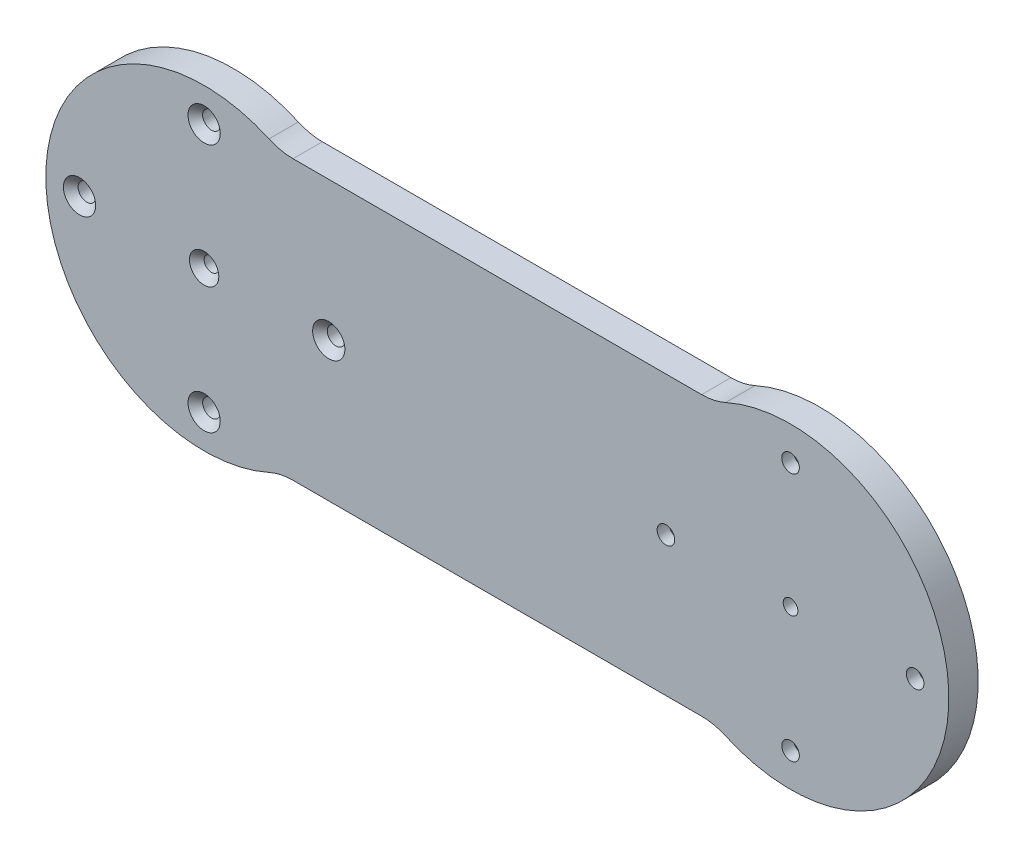
ISO-10303-21;
HEADER;
FILE_DESCRIPTION(('STEP AP214'),'2;1');
FILE_NAME('part.step','',(''),(''),'','','');
FILE_SCHEMA(('AUTOMOTIVE_DESIGN { 1 0 10303 214 1 1 1 1 }'));
ENDSEC;
DATA;
#1=APPLICATION_CONTEXT('core data for automotive mechanical design processes');
#2=APPLICATION_PROTOCOL_DEFINITION('international standard','automotive_design',2000,#1);
#3=PRODUCT_CONTEXT('',#1,'mechanical');
#4=PRODUCT('Part','Part','',(#3));
#5=PRODUCT_RELATED_PRODUCT_CATEGORY('part','',(#4));
#6=PRODUCT_DEFINITION_FORMATION('','',#4);
#7=PRODUCT_DEFINITION_CONTEXT('part definition',#1,'design');
#8=PRODUCT_DEFINITION('design','',#6,#7);
#9=PRODUCT_DEFINITION_SHAPE('','',#8);
#10=(LENGTH_UNIT() NAMED_UNIT(*) SI_UNIT(.MILLI.,.METRE.));
#11=(NAMED_UNIT(*) PLANE_ANGLE_UNIT() SI_UNIT($,.RADIAN.));
#12=(NAMED_UNIT(*) SI_UNIT($,.STERADIAN.) SOLID_ANGLE_UNIT());
#13=UNCERTAINTY_MEASURE_WITH_UNIT(LENGTH_MEASURE(1.E-05),#10,'distance_accuracy_value','');
#14=(GEOMETRIC_REPRESENTATION_CONTEXT(3) GLOBAL_UNCERTAINTY_ASSIGNED_CONTEXT((#13)) GLOBAL_UNIT_ASSIGNED_CONTEXT((#10,
#11,#12)) REPRESENTATION_CONTEXT('',''));
#15=CARTESIAN_POINT('',(0.,0.,0.));
#16=DIRECTION('',(0.,0.,1.));
#17=DIRECTION('',(1.,0.,0.));
#18=AXIS2_PLACEMENT_3D('',#15,#16,#17);
#19=CARTESIAN_POINT('',(124.619535604546,0.,10.));
#20=DIRECTION('',(0.,0.,-1.));
#21=DIRECTION('',(-1.,0.,0.));
#22=AXIS2_PLACEMENT_3D('',#19,#20,#21);
#23=CYLINDRICAL_SURFACE('',#22,2.50000000000001);
#24=CARTESIAN_POINT('',(124.619535604546,0.,10.));
#25=DIRECTION('',(0.,0.,-1.));
#26=DIRECTION('',(-1.,0.,0.));
#27=AXIS2_PLACEMENT_3D('',#24,#25,#26);
#28=CIRCLE('',#27,2.50000000000001);
#29=CARTESIAN_POINT('',(122.119535604546,0.,10.));
#30=VERTEX_POINT('',#29);
#31=EDGE_CURVE('E167',#30,#30,#28,.T.);
#32=ORIENTED_EDGE('',*,*,#31,.F.);
#33=EDGE_LOOP('',(#32));
#34=FACE_BOUND('',#33,.T.);
#35=CARTESIAN_POINT('',(124.619535604546,0.,6.));
#36=DIRECTION('',(0.,0.,-1.));
#37=DIRECTION('',(-1.,0.,0.));
#38=AXIS2_PLACEMENT_3D('',#35,#36,#37);
#39=CIRCLE('',#38,2.50000000000001);
#40=CARTESIAN_POINT('',(122.119535604546,0.,6.));
#41=VERTEX_POINT('',#40);
#42=EDGE_CURVE('E184',#41,#41,#39,.F.);
#43=ORIENTED_EDGE('',*,*,#42,.F.);
#44=EDGE_LOOP('',(#43));
#45=FACE_BOUND('',#44,.T.);
#46=ADVANCED_FACE('F36',(#34,#45),#23,.F.);
#47=CARTESIAN_POINT('',(82.1195356045464,0.,10.));
#48=DIRECTION('',(0.,0.,-1.));
#49=DIRECTION('',(-1.,0.,0.));
#50=AXIS2_PLACEMENT_3D('',#47,#48,#49);
#51=CYLINDRICAL_SURFACE('',#50,3.00000000000001);
#52=CARTESIAN_POINT('',(82.1195356045464,0.,10.));
#53=DIRECTION('',(0.,0.,-1.));
#54=DIRECTION('',(-1.,0.,0.));
#55=AXIS2_PLACEMENT_3D('',#52,#53,#54);
#56=CIRCLE('',#55,3.00000000000001);
#57=CARTESIAN_POINT('',(79.1195356045464,0.,10.));
#58=VERTEX_POINT('',#57);
#59=EDGE_CURVE('E241',#58,#58,#56,.T.);
#60=ORIENTED_EDGE('',*,*,#59,.F.);
#61=EDGE_LOOP('',(#60));
#62=FACE_BOUND('',#61,.T.);
#63=CARTESIAN_POINT('',(82.1195356045464,0.,6.));
#64=DIRECTION('',(0.,0.,-1.));
#65=DIRECTION('',(-1.,0.,0.));
#66=AXIS2_PLACEMENT_3D('',#63,#64,#65);
#67=CIRCLE('',#66,3.00000000000001);
#68=CARTESIAN_POINT('',(79.1195356045464,0.,6.));
#69=VERTEX_POINT('',#68);
#70=EDGE_CURVE('E179',#69,#69,#67,.F.);
#71=ORIENTED_EDGE('',*,*,#70,.F.);
#72=EDGE_LOOP('',(#71));
#73=FACE_BOUND('',#72,.T.);
#74=ADVANCED_FACE('F348',(#62,#73),#51,.F.);
#75=CARTESIAN_POINT('',(124.619535604546,-42.5,10.));
#76=DIRECTION('',(0.,0.,-1.));
#77=DIRECTION('',(-1.,0.,0.));
#78=AXIS2_PLACEMENT_3D('',#75,#76,#77);
#79=CYLINDRICAL_SURFACE('',#78,3.00000000000001);
#80=CARTESIAN_POINT('',(124.619535604546,-42.5,10.));
#81=DIRECTION('',(0.,0.,-1.));
#82=DIRECTION('',(-1.,0.,0.));
#83=AXIS2_PLACEMENT_3D('',#80,#81,#82);
#84=CIRCLE('',#83,3.00000000000001);
#85=CARTESIAN_POINT('',(121.619535604546,-42.5,10.));
#86=VERTEX_POINT('',#85);
#87=EDGE_CURVE('E245',#86,#86,#84,.T.);
#88=ORIENTED_EDGE('',*,*,#87,.F.);
#89=EDGE_LOOP('',(#88));
#90=FACE_BOUND('',#89,.T.);
#91=CARTESIAN_POINT('',(124.619535604546,-42.5,6.));
#92=DIRECTION('',(0.,0.,-1.));
#93=DIRECTION('',(-1.,0.,0.));
#94=AXIS2_PLACEMENT_3D('',#91,#92,#93);
#95=CIRCLE('',#94,3.00000000000001);
#96=CARTESIAN_POINT('',(121.619535604546,-42.5,6.));
#97=VERTEX_POINT('',#96);
#98=EDGE_CURVE('E174',#97,#97,#95,.F.);
#99=ORIENTED_EDGE('',*,*,#98,.F.);
#100=EDGE_LOOP('',(#99));
#101=FACE_BOUND('',#100,.T.);
#102=ADVANCED_FACE('F353',(#90,#101),#79,.F.);
#103=CARTESIAN_POINT('',(167.119535604546,0.,10.));
#104=DIRECTION('',(0.,0.,-1.));
#105=DIRECTION('',(-1.,0.,0.));
#106=AXIS2_PLACEMENT_3D('',#103,#104,#105);
#107=CYLINDRICAL_SURFACE('',#106,2.99999999999999);
#108=CARTESIAN_POINT('',(167.119535604546,0.,10.));
#109=DIRECTION('',(0.,0.,-1.));
#110=DIRECTION('',(-1.,0.,0.));
#111=AXIS2_PLACEMENT_3D('',#108,#109,#110);
#112=CIRCLE('',#111,2.99999999999999);
#113=CARTESIAN_POINT('',(164.119535604546,0.,10.));
#114=VERTEX_POINT('',#113);
#115=EDGE_CURVE('E237',#114,#114,#112,.T.);
#116=ORIENTED_EDGE('',*,*,#115,.F.);
#117=EDGE_LOOP('',(#116));
#118=FACE_BOUND('',#117,.T.);
#119=CARTESIAN_POINT('',(167.119535604546,0.,6.));
#120=DIRECTION('',(0.,0.,-1.));
#121=DIRECTION('',(-1.,0.,0.));
#122=AXIS2_PLACEMENT_3D('',#119,#120,#121);
#123=CIRCLE('',#122,2.99999999999999);
#124=CARTESIAN_POINT('',(164.119535604546,0.,6.));
#125=VERTEX_POINT('',#124);
#126=EDGE_CURVE('E169',#125,#125,#123,.F.);
#127=ORIENTED_EDGE('',*,*,#126,.F.);
#128=EDGE_LOOP('',(#127));
#129=FACE_BOUND('',#128,.T.);
#130=ADVANCED_FACE('F358',(#118,#129),#107,.F.);
#131=CARTESIAN_POINT('',(124.619535604546,42.5,10.));
#132=DIRECTION('',(0.,0.,-1.));
#133=DIRECTION('',(-1.,0.,0.));
#134=AXIS2_PLACEMENT_3D('',#131,#132,#133);
#135=CYLINDRICAL_SURFACE('',#134,3.00000000000001);
#136=CARTESIAN_POINT('',(124.619535604546,42.5,10.));
#137=DIRECTION('',(0.,0.,-1.));
#138=DIRECTION('',(-1.,0.,0.));
#139=AXIS2_PLACEMENT_3D('',#136,#137,#138);
#140=CIRCLE('',#139,3.00000000000001);
#141=CARTESIAN_POINT('',(121.619535604546,42.5,10.));
#142=VERTEX_POINT('',#141);
#143=EDGE_CURVE('E248',#142,#142,#140,.T.);
#144=ORIENTED_EDGE('',*,*,#143,.F.);
#145=EDGE_LOOP('',(#144));
#146=FACE_BOUND('',#145,.T.);
#147=CARTESIAN_POINT('',(124.619535604546,42.5,6.));
#148=DIRECTION('',(0.,0.,-1.));
#149=DIRECTION('',(-1.,0.,0.));
#150=AXIS2_PLACEMENT_3D('',#147,#148,#149);
#151=CIRCLE('',#150,3.00000000000001);
#152=CARTESIAN_POINT('',(121.619535604546,42.5,6.));
#153=VERTEX_POINT('',#152);
#154=EDGE_CURVE('E164',#153,#153,#151,.F.);
#155=ORIENTED_EDGE('',*,*,#154,.F.);
#156=EDGE_LOOP('',(#155));
#157=FACE_BOUND('',#156,.T.);
#158=ADVANCED_FACE('F360',(#146,#157),#135,.F.);
#159=CARTESIAN_POINT('',(-75.3804643954536,0.,10.));
#160=DIRECTION('',(0.,0.,-1.));
#161=DIRECTION('',(-1.,0.,0.));
#162=AXIS2_PLACEMENT_3D('',#159,#160,#161);
#163=CYLINDRICAL_SURFACE('',#162,54.);
#164=CARTESIAN_POINT('',(-75.3804643954536,0.,0.));
#165=DIRECTION('',(0.,0.,1.));
#166=DIRECTION('',(1.,0.,0.));
#167=AXIS2_PLACEMENT_3D('',#164,#165,#166);
#168=CIRCLE('',#167,54.);
#169=CARTESIAN_POINT('',(-53.2496733159261,49.2567567567568,0.));
#170=VERTEX_POINT('',#169);
#171=CARTESIAN_POINT('',(-53.2496733159261,-49.2567567567568,0.));
#172=VERTEX_POINT('',#171);
#173=EDGE_CURVE('E135',#170,#172,#168,.T.);
#174=ORIENTED_EDGE('',*,*,#173,.T.);
#175=DIRECTION('',(0.,0.,-1.));
#176=VECTOR('',#175,1.);
#177=CARTESIAN_POINT('',(-53.2496733159261,-49.2567567567568,10.));
#178=LINE('',#177,#176);
#179=CARTESIAN_POINT('',(-53.2496733159261,-49.2567567567568,10.));
#180=VERTEX_POINT('',#179);
#181=EDGE_CURVE('E147',#172,#180,#178,.F.);
#182=ORIENTED_EDGE('',*,*,#181,.T.);
#183=CARTESIAN_POINT('',(-75.3804643954536,0.,10.));
#184=DIRECTION('',(0.,0.,1.));
#185=DIRECTION('',(1.,0.,0.));
#186=AXIS2_PLACEMENT_3D('',#183,#184,#185);
#187=CIRCLE('',#186,54.);
#188=CARTESIAN_POINT('',(-53.2496733159261,49.2567567567568,10.));
#189=VERTEX_POINT('',#188);
#190=EDGE_CURVE('E133',#189,#180,#187,.T.);
#191=ORIENTED_EDGE('',*,*,#190,.F.);
#192=DIRECTION('',(0.,0.,-1.));
#193=VECTOR('',#192,1.);
#194=CARTESIAN_POINT('',(-53.2496733159261,49.2567567567568,10.));
#195=LINE('',#194,#193);
#196=EDGE_CURVE('E144',#189,#170,#195,.T.);
#197=ORIENTED_EDGE('',*,*,#196,.T.);
#198=EDGE_LOOP('',(#174,#182,#191,#197));
#199=FACE_BOUND('',#198,.T.);
#200=ADVANCED_FACE('F259',(#199),#163,.T.);
#201=CARTESIAN_POINT('',(-49.694865317371,-47.5,10.));
#202=DIRECTION('',(0.,1.,0.));
#203=DIRECTION('',(0.,0.,1.));
#204=AXIS2_PLACEMENT_3D('',#201,#202,#203);
#205=PLANE('',#204);
#206=DIRECTION('',(1.,0.,0.));
#207=VECTOR('',#206,1.);
#208=CARTESIAN_POINT('',(-49.694865317371,-47.5,0.));
#209=LINE('',#208,#207);
#210=CARTESIAN_POINT('',(-45.0530840272122,-47.5,0.));
#211=VERTEX_POINT('',#210);
#212=CARTESIAN_POINT('',(94.2921552363049,-47.5,0.));
#213=VERTEX_POINT('',#212);
#214=EDGE_CURVE('E131',#211,#213,#209,.T.);
#215=ORIENTED_EDGE('',*,*,#214,.T.);
#216=DIRECTION('',(0.,0.,1.));
#217=VECTOR('',#216,1.);
#218=CARTESIAN_POINT('',(94.2921552363049,-47.5,10.));
#219=LINE('',#218,#217);
#220=CARTESIAN_POINT('',(94.2921552363049,-47.5,10.));
#221=VERTEX_POINT('',#220);
#222=EDGE_CURVE('E108',#213,#221,#219,.T.);
#223=ORIENTED_EDGE('',*,*,#222,.T.);
#224=DIRECTION('',(1.,0.,0.));
#225=VECTOR('',#224,1.);
#226=CARTESIAN_POINT('',(-49.694865317371,-47.5,10.));
#227=LINE('',#226,#225);
#228=CARTESIAN_POINT('',(-45.0530840272122,-47.5,10.));
#229=VERTEX_POINT('',#228);
#230=EDGE_CURVE('E264',#229,#221,#227,.T.);
#231=ORIENTED_EDGE('',*,*,#230,.F.);
#232=DIRECTION('',(0.,0.,1.));
#233=VECTOR('',#232,1.);
#234=CARTESIAN_POINT('',(-45.0530840272122,-47.5,0.));
#235=LINE('',#234,#233);
#236=EDGE_CURVE('E123',#229,#211,#235,.F.);
#237=ORIENTED_EDGE('',*,*,#236,.T.);
#238=EDGE_LOOP('',(#215,#223,#231,#237));
#239=FACE_BOUND('',#238,.T.);
#240=ADVANCED_FACE('F373',(#239),#205,.F.);
#241=CARTESIAN_POINT('',(124.619535604546,0.,10.));
#242=DIRECTION('',(0.,0.,-1.));
#243=DIRECTION('',(-1.,0.,0.));
#244=AXIS2_PLACEMENT_3D('',#241,#242,#243);
#245=CYLINDRICAL_SURFACE('',#244,54.);
#246=CARTESIAN_POINT('',(124.619535604546,0.,10.));
#247=DIRECTION('',(0.,0.,1.));
#248=DIRECTION('',(1.,0.,0.));
#249=AXIS2_PLACEMENT_3D('',#246,#247,#248);
#250=CIRCLE('',#249,54.);
#251=CARTESIAN_POINT('',(102.488744525019,-49.2567567567568,10.));
#252=VERTEX_POINT('',#251);
#253=CARTESIAN_POINT('',(102.488744525019,49.2567567567568,10.));
#254=VERTEX_POINT('',#253);
#255=EDGE_CURVE('E122',#252,#254,#250,.T.);
#256=ORIENTED_EDGE('',*,*,#255,.F.);
#257=DIRECTION('',(0.,0.,-1.));
#258=VECTOR('',#257,1.);
#259=CARTESIAN_POINT('',(102.488744525019,-49.2567567567568,10.));
#260=LINE('',#259,#258);
#261=CARTESIAN_POINT('',(102.488744525019,-49.2567567567568,0.));
#262=VERTEX_POINT('',#261);
#263=EDGE_CURVE('E107',#252,#262,#260,.T.);
#264=ORIENTED_EDGE('',*,*,#263,.T.);
#265=CARTESIAN_POINT('',(124.619535604546,0.,0.));
#266=DIRECTION('',(0.,0.,1.));
#267=DIRECTION('',(1.,0.,0.));
#268=AXIS2_PLACEMENT_3D('',#265,#266,#267);
#269=CIRCLE('',#268,54.);
#270=CARTESIAN_POINT('',(102.488744525019,49.2567567567568,0.));
#271=VERTEX_POINT('',#270);
#272=EDGE_CURVE('E120',#262,#271,#269,.T.);
#273=ORIENTED_EDGE('',*,*,#272,.T.);
#274=DIRECTION('',(0.,0.,-1.));
#275=VECTOR('',#274,1.);
#276=CARTESIAN_POINT('',(102.488744525019,49.2567567567568,10.));
#277=LINE('',#276,#275);
#278=EDGE_CURVE('E124',#271,#254,#277,.F.);
#279=ORIENTED_EDGE('',*,*,#278,.T.);
#280=EDGE_LOOP('',(#256,#264,#273,#279));
#281=FACE_BOUND('',#280,.T.);
#282=ADVANCED_FACE('F119',(#281),#245,.T.);
#283=CARTESIAN_POINT('',(-49.694865317371,47.5,10.));
#284=DIRECTION('',(0.,-1.,0.));
#285=DIRECTION('',(0.,0.,-1.));
#286=AXIS2_PLACEMENT_3D('',#283,#284,#285);
#287=PLANE('',#286);
#288=DIRECTION('',(-1.,0.,0.));
#289=VECTOR('',#288,1.);
#290=CARTESIAN_POINT('',(-49.694865317371,47.5,10.));
#291=LINE('',#290,#289);
#292=CARTESIAN_POINT('',(94.2921552363049,47.5,10.));
#293=VERTEX_POINT('',#292);
#294=CARTESIAN_POINT('',(-45.0530840272122,47.5,10.));
#295=VERTEX_POINT('',#294);
#296=EDGE_CURVE('E139',#293,#295,#291,.T.);
#297=ORIENTED_EDGE('',*,*,#296,.F.);
#298=DIRECTION('',(0.,0.,1.));
#299=VECTOR('',#298,1.);
#300=CARTESIAN_POINT('',(94.2921552363049,47.5,0.));
#301=LINE('',#300,#299);
#302=CARTESIAN_POINT('',(94.2921552363049,47.5,0.));
#303=VERTEX_POINT('',#302);
#304=EDGE_CURVE('E114',#293,#303,#301,.F.);
#305=ORIENTED_EDGE('',*,*,#304,.T.);
#306=DIRECTION('',(-1.,0.,0.));
#307=VECTOR('',#306,1.);
#308=CARTESIAN_POINT('',(-49.694865317371,47.5,0.));
#309=LINE('',#308,#307);
#310=CARTESIAN_POINT('',(-45.0530840272122,47.5,0.));
#311=VERTEX_POINT('',#310);
#312=EDGE_CURVE('E130',#303,#311,#309,.T.);
#313=ORIENTED_EDGE('',*,*,#312,.T.);
#314=DIRECTION('',(0.,0.,1.));
#315=VECTOR('',#314,1.);
#316=CARTESIAN_POINT('',(-45.0530840272122,47.5,10.));
#317=LINE('',#316,#315);
#318=EDGE_CURVE('E51',#311,#295,#317,.T.);
#319=ORIENTED_EDGE('',*,*,#318,.T.);
#320=EDGE_LOOP('',(#297,#305,#313,#319));
#321=FACE_BOUND('',#320,.T.);
#322=ADVANCED_FACE('F226',(#321),#287,.F.);
#323=CARTESIAN_POINT('',(-75.3804643954536,0.,10.));
#324=DIRECTION('',(0.,0.,1.));
#325=DIRECTION('',(1.,0.,0.));
#326=AXIS2_PLACEMENT_3D('',#323,#324,#325);
#327=PLANE('',#326);
#328=CARTESIAN_POINT('',(-32.8804643954536,0.,10.));
#329=DIRECTION('',(0.,0.,1.));
#330=DIRECTION('',(1.,0.,0.));
#331=AXIS2_PLACEMENT_3D('',#328,#329,#330);
#332=CIRCLE('',#331,5.49999999999998);
#333=CARTESIAN_POINT('',(-27.3804643954537,0.,10.));
#334=VERTEX_POINT('',#333);
#335=EDGE_CURVE('E200',#334,#334,#332,.F.);
#336=ORIENTED_EDGE('',*,*,#335,.T.);
#337=EDGE_LOOP('',(#336));
#338=FACE_BOUND('',#337,.T.);
#339=CARTESIAN_POINT('',(-75.3804643954536,0.,10.));
#340=DIRECTION('',(0.,0.,1.));
#341=DIRECTION('',(1.,0.,0.));
#342=AXIS2_PLACEMENT_3D('',#339,#340,#341);
#343=CIRCLE('',#342,5.00000000000002);
#344=CARTESIAN_POINT('',(-70.3804643954536,0.,10.));
#345=VERTEX_POINT('',#344);
#346=EDGE_CURVE('E197',#345,#345,#343,.F.);
#347=ORIENTED_EDGE('',*,*,#346,.T.);
#348=EDGE_LOOP('',(#347));
#349=FACE_BOUND('',#348,.T.);
#350=CARTESIAN_POINT('',(-75.3804643954536,42.5,10.));
#351=DIRECTION('',(0.,0.,1.));
#352=DIRECTION('',(1.,0.,0.));
#353=AXIS2_PLACEMENT_3D('',#350,#351,#352);
#354=CIRCLE('',#353,5.50000000000006);
#355=CARTESIAN_POINT('',(-69.8804643954536,42.5,10.));
#356=VERTEX_POINT('',#355);
#357=EDGE_CURVE('E194',#356,#356,#354,.F.);
#358=ORIENTED_EDGE('',*,*,#357,.T.);
#359=EDGE_LOOP('',(#358));
#360=FACE_BOUND('',#359,.T.);
#361=CARTESIAN_POINT('',(-117.880464395454,0.,10.));
#362=DIRECTION('',(0.,0.,1.));
#363=DIRECTION('',(1.,0.,0.));
#364=AXIS2_PLACEMENT_3D('',#361,#362,#363);
#365=CIRCLE('',#364,5.50000000000006);
#366=CARTESIAN_POINT('',(-112.380464395454,0.,10.));
#367=VERTEX_POINT('',#366);
#368=EDGE_CURVE('E191',#367,#367,#365,.F.);
#369=ORIENTED_EDGE('',*,*,#368,.T.);
#370=EDGE_LOOP('',(#369));
#371=FACE_BOUND('',#370,.T.);
#372=CARTESIAN_POINT('',(-75.3804643954536,-42.5,10.));
#373=DIRECTION('',(0.,0.,1.));
#374=DIRECTION('',(1.,0.,0.));
#375=AXIS2_PLACEMENT_3D('',#372,#373,#374);
#376=CIRCLE('',#375,5.50000000000006);
#377=CARTESIAN_POINT('',(-69.8804643954536,-42.5,10.));
#378=VERTEX_POINT('',#377);
#379=EDGE_CURVE('E163',#378,#378,#376,.F.);
#380=ORIENTED_EDGE('',*,*,#379,.T.);
#381=EDGE_LOOP('',(#380));
#382=FACE_BOUND('',#381,.T.);
#383=ORIENTED_EDGE('',*,*,#31,.T.);
#384=EDGE_LOOP('',(#383));
#385=FACE_BOUND('',#384,.T.);
#386=ORIENTED_EDGE('',*,*,#115,.T.);
#387=EDGE_LOOP('',(#386));
#388=FACE_BOUND('',#387,.T.);
#389=ORIENTED_EDGE('',*,*,#59,.T.);
#390=EDGE_LOOP('',(#389));
#391=FACE_BOUND('',#390,.T.);
#392=ORIENTED_EDGE('',*,*,#87,.T.);
#393=EDGE_LOOP('',(#392));
#394=FACE_BOUND('',#393,.T.);
#395=ORIENTED_EDGE('',*,*,#143,.T.);
#396=EDGE_LOOP('',(#395));
#397=FACE_BOUND('',#396,.T.);
#398=ORIENTED_EDGE('',*,*,#296,.T.);
#399=CARTESIAN_POINT('',(-45.0530840272122,67.5,10.));
#400=DIRECTION('',(0.,0.,1.));
#401=DIRECTION('',(1.,0.,0.));
#402=AXIS2_PLACEMENT_3D('',#399,#400,#401);
#403=CIRCLE('',#402,20.);
#404=EDGE_CURVE('E161',#295,#189,#403,.F.);
#405=ORIENTED_EDGE('',*,*,#404,.T.);
#406=ORIENTED_EDGE('',*,*,#190,.T.);
#407=CARTESIAN_POINT('',(-45.0530840272122,-67.5,10.));
#408=DIRECTION('',(0.,0.,1.));
#409=DIRECTION('',(1.,0.,0.));
#410=AXIS2_PLACEMENT_3D('',#407,#408,#409);
#411=CIRCLE('',#410,20.);
#412=EDGE_CURVE('E155',#180,#229,#411,.F.);
#413=ORIENTED_EDGE('',*,*,#412,.T.);
#414=ORIENTED_EDGE('',*,*,#230,.T.);
#415=CARTESIAN_POINT('',(94.2921552363049,-67.5,10.));
#416=DIRECTION('',(0.,0.,1.));
#417=DIRECTION('',(1.,0.,0.));
#418=AXIS2_PLACEMENT_3D('',#415,#416,#417);
#419=CIRCLE('',#418,20.);
#420=EDGE_CURVE('E113',#221,#252,#419,.F.);
#421=ORIENTED_EDGE('',*,*,#420,.T.);
#422=ORIENTED_EDGE('',*,*,#255,.T.);
#423=CARTESIAN_POINT('',(94.2921552363049,67.5,10.));
#424=DIRECTION('',(0.,0.,1.));
#425=DIRECTION('',(1.,0.,0.));
#426=AXIS2_PLACEMENT_3D('',#423,#424,#425);
#427=CIRCLE('',#426,20.);
#428=EDGE_CURVE('E58',#254,#293,#427,.F.);
#429=ORIENTED_EDGE('',*,*,#428,.T.);
#430=EDGE_LOOP('',(#398,#405,#406,#413,#414,#421,#422,#429));
#431=FACE_BOUND('',#430,.T.);
#432=ADVANCED_FACE('F223',(#338,#349,#360,#371,#382,#385,#388,#391,#394,#397,#431),#327,.T.);
#433=CARTESIAN_POINT('',(-75.3804643954536,0.,0.));
#434=DIRECTION('',(0.,0.,1.));
#435=DIRECTION('',(1.,0.,0.));
#436=AXIS2_PLACEMENT_3D('',#433,#434,#435);
#437=PLANE('',#436);
#438=CARTESIAN_POINT('',(-117.880464395454,0.,0.));
#439=DIRECTION('',(0.,0.,-1.));
#440=DIRECTION('',(-1.,0.,0.));
#441=AXIS2_PLACEMENT_3D('',#438,#439,#440);
#442=CIRCLE('',#441,3.00000000000001);
#443=CARTESIAN_POINT('',(-120.880464395454,0.,0.));
#444=VERTEX_POINT('',#443);
#445=EDGE_CURVE('E305',#444,#444,#442,.T.);
#446=ORIENTED_EDGE('',*,*,#445,.F.);
#447=EDGE_LOOP('',(#446));
#448=FACE_BOUND('',#447,.T.);
#449=CARTESIAN_POINT('',(-32.8804643954536,0.,0.));
#450=DIRECTION('',(0.,0.,-1.));
#451=DIRECTION('',(-1.,0.,0.));
#452=AXIS2_PLACEMENT_3D('',#449,#450,#451);
#453=CIRCLE('',#452,3.);
#454=CARTESIAN_POINT('',(-35.8804643954536,0.,0.));
#455=VERTEX_POINT('',#454);
#456=EDGE_CURVE('E302',#455,#455,#453,.T.);
#457=ORIENTED_EDGE('',*,*,#456,.F.);
#458=EDGE_LOOP('',(#457));
#459=FACE_BOUND('',#458,.T.);
#460=CARTESIAN_POINT('',(-75.3804643954536,-42.5,0.));
#461=DIRECTION('',(0.,0.,-1.));
#462=DIRECTION('',(-1.,0.,0.));
#463=AXIS2_PLACEMENT_3D('',#460,#461,#462);
#464=CIRCLE('',#463,3.00000000000001);
#465=CARTESIAN_POINT('',(-78.3804643954536,-42.5,0.));
#466=VERTEX_POINT('',#465);
#467=EDGE_CURVE('E299',#466,#466,#464,.T.);
#468=ORIENTED_EDGE('',*,*,#467,.F.);
#469=EDGE_LOOP('',(#468));
#470=FACE_BOUND('',#469,.T.);
#471=CARTESIAN_POINT('',(-75.3804643954536,42.5,0.));
#472=DIRECTION('',(0.,0.,-1.));
#473=DIRECTION('',(-1.,0.,0.));
#474=AXIS2_PLACEMENT_3D('',#471,#472,#473);
#475=CIRCLE('',#474,3.00000000000001);
#476=CARTESIAN_POINT('',(-78.3804643954536,42.5,0.));
#477=VERTEX_POINT('',#476);
#478=EDGE_CURVE('E296',#477,#477,#475,.T.);
#479=ORIENTED_EDGE('',*,*,#478,.F.);
#480=EDGE_LOOP('',(#479));
#481=FACE_BOUND('',#480,.T.);
#482=CARTESIAN_POINT('',(-75.3804643954536,0.,0.));
#483=DIRECTION('',(0.,0.,-1.));
#484=DIRECTION('',(-1.,0.,0.));
#485=AXIS2_PLACEMENT_3D('',#482,#483,#484);
#486=CIRCLE('',#485,2.50000000000001);
#487=CARTESIAN_POINT('',(-77.8804643954536,0.,0.));
#488=VERTEX_POINT('',#487);
#489=EDGE_CURVE('E291',#488,#488,#486,.T.);
#490=ORIENTED_EDGE('',*,*,#489,.F.);
#491=EDGE_LOOP('',(#490));
#492=FACE_BOUND('',#491,.T.);
#493=CARTESIAN_POINT('',(124.619535604546,0.,0.));
#494=DIRECTION('',(0.,0.,-1.));
#495=DIRECTION('',(-1.,0.,0.));
#496=AXIS2_PLACEMENT_3D('',#493,#494,#495);
#497=CIRCLE('',#496,5.);
#498=CARTESIAN_POINT('',(119.619535604546,0.,0.));
#499=VERTEX_POINT('',#498);
#500=EDGE_CURVE('E288',#499,#499,#497,.T.);
#501=ORIENTED_EDGE('',*,*,#500,.F.);
#502=EDGE_LOOP('',(#501));
#503=FACE_BOUND('',#502,.T.);
#504=CARTESIAN_POINT('',(82.1195356045464,0.,0.));
#505=DIRECTION('',(0.,0.,-1.));
#506=DIRECTION('',(-1.,0.,0.));
#507=AXIS2_PLACEMENT_3D('',#504,#505,#506);
#508=CIRCLE('',#507,5.5);
#509=CARTESIAN_POINT('',(76.6195356045464,0.,0.));
#510=VERTEX_POINT('',#509);
#511=EDGE_CURVE('E187',#510,#510,#508,.T.);
#512=ORIENTED_EDGE('',*,*,#511,.F.);
#513=EDGE_LOOP('',(#512));
#514=FACE_BOUND('',#513,.T.);
#515=CARTESIAN_POINT('',(124.619535604546,-42.5,0.));
#516=DIRECTION('',(0.,0.,-1.));
#517=DIRECTION('',(-1.,0.,0.));
#518=AXIS2_PLACEMENT_3D('',#515,#516,#517);
#519=CIRCLE('',#518,5.5);
#520=CARTESIAN_POINT('',(119.119535604546,-42.5,0.));
#521=VERTEX_POINT('',#520);
#522=EDGE_CURVE('E182',#521,#521,#519,.T.);
#523=ORIENTED_EDGE('',*,*,#522,.F.);
#524=EDGE_LOOP('',(#523));
#525=FACE_BOUND('',#524,.T.);
#526=CARTESIAN_POINT('',(167.119535604546,0.,0.));
#527=DIRECTION('',(0.,0.,-1.));
#528=DIRECTION('',(-1.,0.,0.));
#529=AXIS2_PLACEMENT_3D('',#526,#527,#528);
#530=CIRCLE('',#529,5.50000000000002);
#531=CARTESIAN_POINT('',(161.619535604546,0.,0.));
#532=VERTEX_POINT('',#531);
#533=EDGE_CURVE('E177',#532,#532,#530,.T.);
#534=ORIENTED_EDGE('',*,*,#533,.F.);
#535=EDGE_LOOP('',(#534));
#536=FACE_BOUND('',#535,.T.);
#537=CARTESIAN_POINT('',(124.619535604546,42.5,0.));
#538=DIRECTION('',(0.,0.,-1.));
#539=DIRECTION('',(-1.,0.,0.));
#540=AXIS2_PLACEMENT_3D('',#537,#538,#539);
#541=CIRCLE('',#540,5.5);
#542=CARTESIAN_POINT('',(119.119535604546,42.5,0.));
#543=VERTEX_POINT('',#542);
#544=EDGE_CURVE('E172',#543,#543,#541,.T.);
#545=ORIENTED_EDGE('',*,*,#544,.F.);
#546=EDGE_LOOP('',(#545));
#547=FACE_BOUND('',#546,.T.);
#548=ORIENTED_EDGE('',*,*,#173,.F.);
#549=CARTESIAN_POINT('',(-45.0530840272122,67.5,0.));
#550=DIRECTION('',(0.,0.,1.));
#551=DIRECTION('',(1.,0.,0.));
#552=AXIS2_PLACEMENT_3D('',#549,#550,#551);
#553=CIRCLE('',#552,20.);
#554=EDGE_CURVE('E159',#170,#311,#553,.T.);
#555=ORIENTED_EDGE('',*,*,#554,.T.);
#556=ORIENTED_EDGE('',*,*,#312,.F.);
#557=CARTESIAN_POINT('',(94.2921552363049,67.5,0.));
#558=DIRECTION('',(0.,0.,1.));
#559=DIRECTION('',(1.,0.,0.));
#560=AXIS2_PLACEMENT_3D('',#557,#558,#559);
#561=CIRCLE('',#560,20.);
#562=EDGE_CURVE('E129',#303,#271,#561,.T.);
#563=ORIENTED_EDGE('',*,*,#562,.T.);
#564=ORIENTED_EDGE('',*,*,#272,.F.);
#565=CARTESIAN_POINT('',(94.2921552363049,-67.5,0.));
#566=DIRECTION('',(0.,0.,1.));
#567=DIRECTION('',(1.,0.,0.));
#568=AXIS2_PLACEMENT_3D('',#565,#566,#567);
#569=CIRCLE('',#568,20.);
#570=EDGE_CURVE('E103',#262,#213,#569,.T.);
#571=ORIENTED_EDGE('',*,*,#570,.T.);
#572=ORIENTED_EDGE('',*,*,#214,.F.);
#573=CARTESIAN_POINT('',(-45.0530840272122,-67.5,0.));
#574=DIRECTION('',(0.,0.,1.));
#575=DIRECTION('',(1.,0.,0.));
#576=AXIS2_PLACEMENT_3D('',#573,#574,#575);
#577=CIRCLE('',#576,20.);
#578=EDGE_CURVE('E153',#211,#172,#577,.T.);
#579=ORIENTED_EDGE('',*,*,#578,.T.);
#580=EDGE_LOOP('',(#548,#555,#556,#563,#564,#571,#572,#579));
#581=FACE_BOUND('',#580,.T.);
#582=ADVANCED_FACE('F127',(#448,#459,#470,#481,#492,#503,#514,#525,#536,#547,#581),#437,.F.);
#583=CARTESIAN_POINT('',(94.2921552363049,-67.5,10.));
#584=DIRECTION('',(0.,0.,-1.));
#585=DIRECTION('',(-1.,0.,0.));
#586=AXIS2_PLACEMENT_3D('',#583,#584,#585);
#587=CYLINDRICAL_SURFACE('',#586,20.);
#588=ORIENTED_EDGE('',*,*,#420,.F.);
#589=ORIENTED_EDGE('',*,*,#222,.F.);
#590=ORIENTED_EDGE('',*,*,#570,.F.);
#591=ORIENTED_EDGE('',*,*,#263,.F.);
#592=EDGE_LOOP('',(#588,#589,#590,#591));
#593=FACE_BOUND('',#592,.T.);
#594=ADVANCED_FACE('F106',(#593),#587,.F.);
#595=CARTESIAN_POINT('',(-45.0530840272122,-67.5,10.));
#596=DIRECTION('',(0.,0.,-1.));
#597=DIRECTION('',(-1.,0.,0.));
#598=AXIS2_PLACEMENT_3D('',#595,#596,#597);
#599=CYLINDRICAL_SURFACE('',#598,20.);
#600=ORIENTED_EDGE('',*,*,#412,.F.);
#601=ORIENTED_EDGE('',*,*,#181,.F.);
#602=ORIENTED_EDGE('',*,*,#578,.F.);
#603=ORIENTED_EDGE('',*,*,#236,.F.);
#604=EDGE_LOOP('',(#600,#601,#602,#603));
#605=FACE_BOUND('',#604,.T.);
#606=ADVANCED_FACE('F381',(#605),#599,.F.);
#607=CARTESIAN_POINT('',(94.2921552363049,67.5,10.));
#608=DIRECTION('',(0.,0.,-1.));
#609=DIRECTION('',(-1.,0.,0.));
#610=AXIS2_PLACEMENT_3D('',#607,#608,#609);
#611=CYLINDRICAL_SURFACE('',#610,20.);
#612=ORIENTED_EDGE('',*,*,#428,.F.);
#613=ORIENTED_EDGE('',*,*,#278,.F.);
#614=ORIENTED_EDGE('',*,*,#562,.F.);
#615=ORIENTED_EDGE('',*,*,#304,.F.);
#616=EDGE_LOOP('',(#612,#613,#614,#615));
#617=FACE_BOUND('',#616,.T.);
#618=ADVANCED_FACE('F384',(#617),#611,.F.);
#619=CARTESIAN_POINT('',(-45.0530840272122,67.5,10.));
#620=DIRECTION('',(0.,0.,-1.));
#621=DIRECTION('',(-1.,0.,0.));
#622=AXIS2_PLACEMENT_3D('',#619,#620,#621);
#623=CYLINDRICAL_SURFACE('',#622,20.);
#624=ORIENTED_EDGE('',*,*,#404,.F.);
#625=ORIENTED_EDGE('',*,*,#318,.F.);
#626=ORIENTED_EDGE('',*,*,#554,.F.);
#627=ORIENTED_EDGE('',*,*,#196,.F.);
#628=EDGE_LOOP('',(#624,#625,#626,#627));
#629=FACE_BOUND('',#628,.T.);
#630=ADVANCED_FACE('F256',(#629),#623,.F.);
#631=CARTESIAN_POINT('',(124.619535604546,42.5,6.));
#632=DIRECTION('',(0.,0.,-1.));
#633=DIRECTION('',(-1.,0.,0.));
#634=AXIS2_PLACEMENT_3D('',#631,#632,#633);
#635=PLANE('',#634);
#636=CARTESIAN_POINT('',(124.619535604546,42.5,6.));
#637=DIRECTION('',(0.,0.,-1.));
#638=DIRECTION('',(-1.,0.,0.));
#639=AXIS2_PLACEMENT_3D('',#636,#637,#638);
#640=CIRCLE('',#639,5.5);
#641=CARTESIAN_POINT('',(119.119535604546,42.5,6.));
#642=VERTEX_POINT('',#641);
#643=EDGE_CURVE('E168',#642,#642,#640,.T.);
#644=ORIENTED_EDGE('',*,*,#643,.T.);
#645=EDGE_LOOP('',(#644));
#646=FACE_BOUND('',#645,.T.);
#647=ORIENTED_EDGE('',*,*,#154,.T.);
#648=EDGE_LOOP('',(#647));
#649=FACE_BOUND('',#648,.T.);
#650=ADVANCED_FACE('F333',(#646,#649),#635,.T.);
#651=CARTESIAN_POINT('',(124.619535604546,42.5,6.));
#652=DIRECTION('',(0.,0.,-1.));
#653=DIRECTION('',(-1.,0.,0.));
#654=AXIS2_PLACEMENT_3D('',#651,#652,#653);
#655=CYLINDRICAL_SURFACE('',#654,5.5);
#656=ORIENTED_EDGE('',*,*,#643,.F.);
#657=EDGE_LOOP('',(#656));
#658=FACE_BOUND('',#657,.T.);
#659=ORIENTED_EDGE('',*,*,#544,.T.);
#660=EDGE_LOOP('',(#659));
#661=FACE_BOUND('',#660,.T.);
#662=ADVANCED_FACE('F330',(#658,#661),#655,.F.);
#663=CARTESIAN_POINT('',(167.119535604546,0.,6.));
#664=DIRECTION('',(0.,0.,-1.));
#665=DIRECTION('',(-1.,0.,0.));
#666=AXIS2_PLACEMENT_3D('',#663,#664,#665);
#667=PLANE('',#666);
#668=CARTESIAN_POINT('',(167.119535604546,0.,6.));
#669=DIRECTION('',(0.,0.,-1.));
#670=DIRECTION('',(-1.,0.,0.));
#671=AXIS2_PLACEMENT_3D('',#668,#669,#670);
#672=CIRCLE('',#671,5.50000000000002);
#673=CARTESIAN_POINT('',(161.619535604546,0.,6.));
#674=VERTEX_POINT('',#673);
#675=EDGE_CURVE('E173',#674,#674,#672,.T.);
#676=ORIENTED_EDGE('',*,*,#675,.T.);
#677=EDGE_LOOP('',(#676));
#678=FACE_BOUND('',#677,.T.);
#679=ORIENTED_EDGE('',*,*,#126,.T.);
#680=EDGE_LOOP('',(#679));
#681=FACE_BOUND('',#680,.T.);
#682=ADVANCED_FACE('F332',(#678,#681),#667,.T.);
#683=CARTESIAN_POINT('',(167.119535604546,0.,6.));
#684=DIRECTION('',(0.,0.,-1.));
#685=DIRECTION('',(-1.,0.,0.));
#686=AXIS2_PLACEMENT_3D('',#683,#684,#685);
#687=CYLINDRICAL_SURFACE('',#686,5.50000000000002);
#688=ORIENTED_EDGE('',*,*,#675,.F.);
#689=EDGE_LOOP('',(#688));
#690=FACE_BOUND('',#689,.T.);
#691=ORIENTED_EDGE('',*,*,#533,.T.);
#692=EDGE_LOOP('',(#691));
#693=FACE_BOUND('',#692,.T.);
#694=ADVANCED_FACE('F340',(#690,#693),#687,.F.);
#695=CARTESIAN_POINT('',(124.619535604546,-42.5,6.));
#696=DIRECTION('',(0.,0.,-1.));
#697=DIRECTION('',(-1.,0.,0.));
#698=AXIS2_PLACEMENT_3D('',#695,#696,#697);
#699=PLANE('',#698);
#700=CARTESIAN_POINT('',(124.619535604546,-42.5,6.));
#701=DIRECTION('',(0.,0.,-1.));
#702=DIRECTION('',(-1.,0.,0.));
#703=AXIS2_PLACEMENT_3D('',#700,#701,#702);
#704=CIRCLE('',#703,5.5);
#705=CARTESIAN_POINT('',(119.119535604546,-42.5,6.));
#706=VERTEX_POINT('',#705);
#707=EDGE_CURVE('E178',#706,#706,#704,.T.);
#708=ORIENTED_EDGE('',*,*,#707,.T.);
#709=EDGE_LOOP('',(#708));
#710=FACE_BOUND('',#709,.T.);
#711=ORIENTED_EDGE('',*,*,#98,.T.);
#712=EDGE_LOOP('',(#711));
#713=FACE_BOUND('',#712,.T.);
#714=ADVANCED_FACE('F442',(#710,#713),#699,.T.);
#715=CARTESIAN_POINT('',(124.619535604546,-42.5,6.));
#716=DIRECTION('',(0.,0.,-1.));
#717=DIRECTION('',(-1.,0.,0.));
#718=AXIS2_PLACEMENT_3D('',#715,#716,#717);
#719=CYLINDRICAL_SURFACE('',#718,5.5);
#720=ORIENTED_EDGE('',*,*,#707,.F.);
#721=EDGE_LOOP('',(#720));
#722=FACE_BOUND('',#721,.T.);
#723=ORIENTED_EDGE('',*,*,#522,.T.);
#724=EDGE_LOOP('',(#723));
#725=FACE_BOUND('',#724,.T.);
#726=ADVANCED_FACE('F437',(#722,#725),#719,.F.);
#727=CARTESIAN_POINT('',(82.1195356045464,0.,6.));
#728=DIRECTION('',(0.,0.,-1.));
#729=DIRECTION('',(-1.,0.,0.));
#730=AXIS2_PLACEMENT_3D('',#727,#728,#729);
#731=PLANE('',#730);
#732=CARTESIAN_POINT('',(82.1195356045464,0.,6.));
#733=DIRECTION('',(0.,0.,-1.));
#734=DIRECTION('',(-1.,0.,0.));
#735=AXIS2_PLACEMENT_3D('',#732,#733,#734);
#736=CIRCLE('',#735,5.5);
#737=CARTESIAN_POINT('',(76.6195356045464,0.,6.));
#738=VERTEX_POINT('',#737);
#739=EDGE_CURVE('E183',#738,#738,#736,.T.);
#740=ORIENTED_EDGE('',*,*,#739,.T.);
#741=EDGE_LOOP('',(#740));
#742=FACE_BOUND('',#741,.T.);
#743=ORIENTED_EDGE('',*,*,#70,.T.);
#744=EDGE_LOOP('',(#743));
#745=FACE_BOUND('',#744,.T.);
#746=ADVANCED_FACE('F434',(#742,#745),#731,.T.);
#747=CARTESIAN_POINT('',(82.1195356045464,0.,6.));
#748=DIRECTION('',(0.,0.,-1.));
#749=DIRECTION('',(-1.,0.,0.));
#750=AXIS2_PLACEMENT_3D('',#747,#748,#749);
#751=CYLINDRICAL_SURFACE('',#750,5.5);
#752=ORIENTED_EDGE('',*,*,#739,.F.);
#753=EDGE_LOOP('',(#752));
#754=FACE_BOUND('',#753,.T.);
#755=ORIENTED_EDGE('',*,*,#511,.T.);
#756=EDGE_LOOP('',(#755));
#757=FACE_BOUND('',#756,.T.);
#758=ADVANCED_FACE('F429',(#754,#757),#751,.F.);
#759=CARTESIAN_POINT('',(124.619535604546,0.,6.));
#760=DIRECTION('',(0.,0.,-1.));
#761=DIRECTION('',(-1.,0.,0.));
#762=AXIS2_PLACEMENT_3D('',#759,#760,#761);
#763=PLANE('',#762);
#764=CARTESIAN_POINT('',(124.619535604546,0.,6.));
#765=DIRECTION('',(0.,0.,-1.));
#766=DIRECTION('',(-1.,0.,0.));
#767=AXIS2_PLACEMENT_3D('',#764,#765,#766);
#768=CIRCLE('',#767,5.);
#769=CARTESIAN_POINT('',(119.619535604546,0.,6.));
#770=VERTEX_POINT('',#769);
#771=EDGE_CURVE('E188',#770,#770,#768,.T.);
#772=ORIENTED_EDGE('',*,*,#771,.T.);
#773=EDGE_LOOP('',(#772));
#774=FACE_BOUND('',#773,.T.);
#775=ORIENTED_EDGE('',*,*,#42,.T.);
#776=EDGE_LOOP('',(#775));
#777=FACE_BOUND('',#776,.T.);
#778=ADVANCED_FACE('F426',(#774,#777),#763,.T.);
#779=CARTESIAN_POINT('',(124.619535604546,0.,6.));
#780=DIRECTION('',(0.,0.,-1.));
#781=DIRECTION('',(-1.,0.,0.));
#782=AXIS2_PLACEMENT_3D('',#779,#780,#781);
#783=CYLINDRICAL_SURFACE('',#782,5.);
#784=ORIENTED_EDGE('',*,*,#771,.F.);
#785=EDGE_LOOP('',(#784));
#786=FACE_BOUND('',#785,.T.);
#787=ORIENTED_EDGE('',*,*,#500,.T.);
#788=EDGE_LOOP('',(#787));
#789=FACE_BOUND('',#788,.T.);
#790=ADVANCED_FACE('F421',(#786,#789),#783,.F.);
#791=CARTESIAN_POINT('',(-75.3804643954536,0.,10.));
#792=DIRECTION('',(0.,0.,-1.));
#793=DIRECTION('',(-1.,0.,0.));
#794=AXIS2_PLACEMENT_3D('',#791,#792,#793);
#795=CYLINDRICAL_SURFACE('',#794,2.50000000000001);
#796=CARTESIAN_POINT('',(-75.3804643954536,0.,7.49999999999997));
#797=DIRECTION('',(0.,0.,1.));
#798=DIRECTION('',(1.,0.,0.));
#799=AXIS2_PLACEMENT_3D('',#796,#797,#798);
#800=CIRCLE('',#799,2.50000000000001);
#801=CARTESIAN_POINT('',(-72.8804643954536,0.,7.49999999999997));
#802=VERTEX_POINT('',#801);
#803=EDGE_CURVE('E206',#802,#802,#800,.T.);
#804=ORIENTED_EDGE('',*,*,#803,.T.);
#805=EDGE_LOOP('',(#804));
#806=FACE_BOUND('',#805,.T.);
#807=ORIENTED_EDGE('',*,*,#489,.T.);
#808=EDGE_LOOP('',(#807));
#809=FACE_BOUND('',#808,.T.);
#810=ADVANCED_FACE('F412',(#806,#809),#795,.F.);
#811=CARTESIAN_POINT('',(-75.3804643954536,42.5,10.));
#812=DIRECTION('',(0.,0.,-1.));
#813=DIRECTION('',(-1.,0.,0.));
#814=AXIS2_PLACEMENT_3D('',#811,#812,#813);
#815=CYLINDRICAL_SURFACE('',#814,3.00000000000001);
#816=CARTESIAN_POINT('',(-75.3804643954536,42.5,7.49999999999994));
#817=DIRECTION('',(0.,0.,1.));
#818=DIRECTION('',(1.,0.,0.));
#819=AXIS2_PLACEMENT_3D('',#816,#817,#818);
#820=CIRCLE('',#819,3.00000000000001);
#821=CARTESIAN_POINT('',(-72.3804643954536,42.5,7.49999999999994));
#822=VERTEX_POINT('',#821);
#823=EDGE_CURVE('E209',#822,#822,#820,.T.);
#824=ORIENTED_EDGE('',*,*,#823,.T.);
#825=EDGE_LOOP('',(#824));
#826=FACE_BOUND('',#825,.T.);
#827=ORIENTED_EDGE('',*,*,#478,.T.);
#828=EDGE_LOOP('',(#827));
#829=FACE_BOUND('',#828,.T.);
#830=ADVANCED_FACE('F408',(#826,#829),#815,.F.);
#831=CARTESIAN_POINT('',(-75.3804643954536,-42.5,10.));
#832=DIRECTION('',(0.,0.,-1.));
#833=DIRECTION('',(-1.,0.,0.));
#834=AXIS2_PLACEMENT_3D('',#831,#832,#833);
#835=CYLINDRICAL_SURFACE('',#834,3.00000000000001);
#836=CARTESIAN_POINT('',(-75.3804643954536,-42.5,7.49999999999994));
#837=DIRECTION('',(0.,0.,1.));
#838=DIRECTION('',(1.,0.,0.));
#839=AXIS2_PLACEMENT_3D('',#836,#837,#838);
#840=CIRCLE('',#839,3.00000000000001);
#841=CARTESIAN_POINT('',(-72.3804643954536,-42.5,7.49999999999994));
#842=VERTEX_POINT('',#841);
#843=EDGE_CURVE('E11',#842,#842,#840,.T.);
#844=ORIENTED_EDGE('',*,*,#843,.T.);
#845=EDGE_LOOP('',(#844));
#846=FACE_BOUND('',#845,.T.);
#847=ORIENTED_EDGE('',*,*,#467,.T.);
#848=EDGE_LOOP('',(#847));
#849=FACE_BOUND('',#848,.T.);
#850=ADVANCED_FACE('F411',(#846,#849),#835,.F.);
#851=CARTESIAN_POINT('',(-32.8804643954536,0.,10.));
#852=DIRECTION('',(0.,0.,-1.));
#853=DIRECTION('',(-1.,0.,0.));
#854=AXIS2_PLACEMENT_3D('',#851,#852,#853);
#855=CYLINDRICAL_SURFACE('',#854,3.);
#856=CARTESIAN_POINT('',(-32.8804643954536,0.,7.50000000000001));
#857=DIRECTION('',(0.,0.,1.));
#858=DIRECTION('',(1.,0.,0.));
#859=AXIS2_PLACEMENT_3D('',#856,#857,#858);
#860=CIRCLE('',#859,3.);
#861=CARTESIAN_POINT('',(-29.8804643954536,0.,7.50000000000001));
#862=VERTEX_POINT('',#861);
#863=EDGE_CURVE('E203',#862,#862,#860,.T.);
#864=ORIENTED_EDGE('',*,*,#863,.T.);
#865=EDGE_LOOP('',(#864));
#866=FACE_BOUND('',#865,.T.);
#867=ORIENTED_EDGE('',*,*,#456,.T.);
#868=EDGE_LOOP('',(#867));
#869=FACE_BOUND('',#868,.T.);
#870=ADVANCED_FACE('F418',(#866,#869),#855,.F.);
#871=CARTESIAN_POINT('',(-117.880464395454,0.,10.));
#872=DIRECTION('',(0.,0.,-1.));
#873=DIRECTION('',(-1.,0.,0.));
#874=AXIS2_PLACEMENT_3D('',#871,#872,#873);
#875=CYLINDRICAL_SURFACE('',#874,3.00000000000001);
#876=CARTESIAN_POINT('',(-117.880464395454,0.,7.49999999999994));
#877=DIRECTION('',(0.,0.,1.));
#878=DIRECTION('',(1.,0.,0.));
#879=AXIS2_PLACEMENT_3D('',#876,#877,#878);
#880=CIRCLE('',#879,3.00000000000001);
#881=CARTESIAN_POINT('',(-114.880464395454,0.,7.49999999999994));
#882=VERTEX_POINT('',#881);
#883=EDGE_CURVE('E44',#882,#882,#880,.T.);
#884=ORIENTED_EDGE('',*,*,#883,.T.);
#885=EDGE_LOOP('',(#884));
#886=FACE_BOUND('',#885,.T.);
#887=ORIENTED_EDGE('',*,*,#445,.T.);
#888=EDGE_LOOP('',(#887));
#889=FACE_BOUND('',#888,.T.);
#890=ADVANCED_FACE('F214',(#886,#889),#875,.F.);
#891=CARTESIAN_POINT('',(-32.8804643954536,0.,10.));
#892=DIRECTION('',(0.,0.,1.));
#893=DIRECTION('',(1.,0.,0.));
#894=AXIS2_PLACEMENT_3D('',#891,#892,#893);
#895=CONICAL_SURFACE('',#894,5.49999999999998,0.785398163397446);
#896=ORIENTED_EDGE('',*,*,#863,.F.);
#897=EDGE_LOOP('',(#896));
#898=FACE_BOUND('',#897,.T.);
#899=ORIENTED_EDGE('',*,*,#335,.F.);
#900=EDGE_LOOP('',(#899));
#901=FACE_BOUND('',#900,.T.);
#902=ADVANCED_FACE('F391',(#898,#901),#895,.F.);
#903=CARTESIAN_POINT('',(-75.3804643954536,0.,10.));
#904=DIRECTION('',(0.,0.,1.));
#905=DIRECTION('',(1.,0.,0.));
#906=AXIS2_PLACEMENT_3D('',#903,#904,#905);
#907=CONICAL_SURFACE('',#906,5.00000000000002,0.785398163397444);
#908=ORIENTED_EDGE('',*,*,#803,.F.);
#909=EDGE_LOOP('',(#908));
#910=FACE_BOUND('',#909,.T.);
#911=ORIENTED_EDGE('',*,*,#346,.F.);
#912=EDGE_LOOP('',(#911));
#913=FACE_BOUND('',#912,.T.);
#914=ADVANCED_FACE('F394',(#910,#913),#907,.F.);
#915=CARTESIAN_POINT('',(-75.3804643954536,42.5,10.));
#916=DIRECTION('',(0.,0.,1.));
#917=DIRECTION('',(1.,0.,0.));
#918=AXIS2_PLACEMENT_3D('',#915,#916,#917);
#919=CONICAL_SURFACE('',#918,5.50000000000006,0.785398163397447);
#920=ORIENTED_EDGE('',*,*,#823,.F.);
#921=EDGE_LOOP('',(#920));
#922=FACE_BOUND('',#921,.T.);
#923=ORIENTED_EDGE('',*,*,#357,.F.);
#924=EDGE_LOOP('',(#923));
#925=FACE_BOUND('',#924,.T.);
#926=ADVANCED_FACE('F220',(#922,#925),#919,.F.);
#927=CARTESIAN_POINT('',(-117.880464395454,0.,10.));
#928=DIRECTION('',(0.,0.,1.));
#929=DIRECTION('',(1.,0.,0.));
#930=AXIS2_PLACEMENT_3D('',#927,#928,#929);
#931=CONICAL_SURFACE('',#930,5.50000000000006,0.785398163397447);
#932=ORIENTED_EDGE('',*,*,#883,.F.);
#933=EDGE_LOOP('',(#932));
#934=FACE_BOUND('',#933,.T.);
#935=ORIENTED_EDGE('',*,*,#368,.F.);
#936=EDGE_LOOP('',(#935));
#937=FACE_BOUND('',#936,.T.);
#938=ADVANCED_FACE('F217',(#934,#937),#931,.F.);
#939=CARTESIAN_POINT('',(-75.3804643954536,-42.5,10.));
#940=DIRECTION('',(0.,0.,1.));
#941=DIRECTION('',(1.,0.,0.));
#942=AXIS2_PLACEMENT_3D('',#939,#940,#941);
#943=CONICAL_SURFACE('',#942,5.50000000000006,0.785398163397447);
#944=ORIENTED_EDGE('',*,*,#843,.F.);
#945=EDGE_LOOP('',(#944));
#946=FACE_BOUND('',#945,.T.);
#947=ORIENTED_EDGE('',*,*,#379,.F.);
#948=EDGE_LOOP('',(#947));
#949=FACE_BOUND('',#948,.T.);
#950=ADVANCED_FACE('F38',(#946,#949),#943,.F.);
#951=CLOSED_SHELL('',(#46,#74,#102,#130,#158,#200,#240,#282,#322,#432,#582,#594,#606,#618,#630,
#650,#662,#682,#694,#714,#726,#746,#758,#778,#790,#810,#830,#850,#870,#890,#902,#914,#926,#938,#950));
#952=MANIFOLD_SOLID_BREP('B2',#951);
#953=ADVANCED_BREP_SHAPE_REPRESENTATION('',(#18,#952),#14);
#954=SHAPE_DEFINITION_REPRESENTATION(#9,#953);
ENDSEC;
END-ISO-10303-21;
